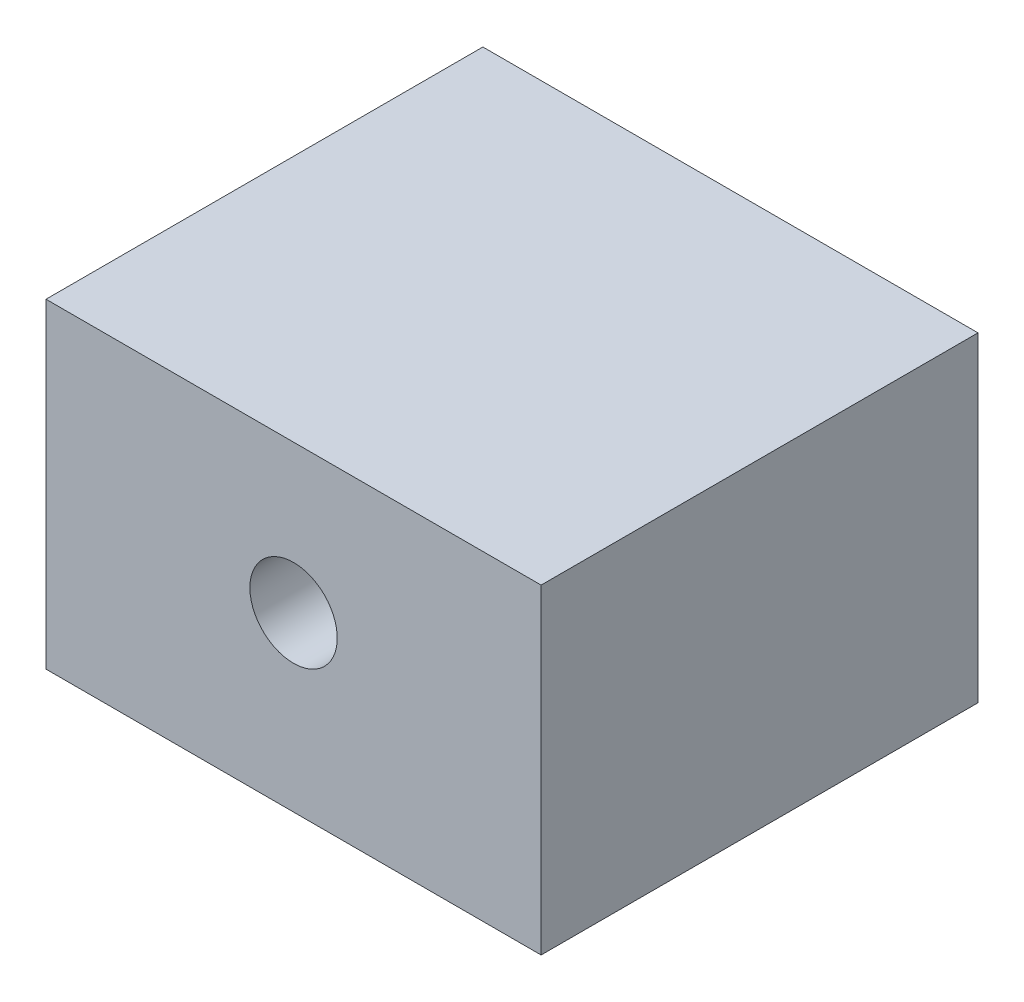
ISO-10303-21;
HEADER;
FILE_DESCRIPTION(('STEP AP214'),'2;1');
FILE_NAME('part.step','',(''),(''),'','','');
FILE_SCHEMA(('AUTOMOTIVE_DESIGN { 1 0 10303 214 1 1 1 1 }'));
ENDSEC;
DATA;
#1=APPLICATION_CONTEXT('core data for automotive mechanical design processes');
#2=APPLICATION_PROTOCOL_DEFINITION('international standard','automotive_design',2000,#1);
#3=PRODUCT_CONTEXT('',#1,'mechanical');
#4=PRODUCT('Part','Part','',(#3));
#5=PRODUCT_RELATED_PRODUCT_CATEGORY('part','',(#4));
#6=PRODUCT_DEFINITION_FORMATION('','',#4);
#7=PRODUCT_DEFINITION_CONTEXT('part definition',#1,'design');
#8=PRODUCT_DEFINITION('design','',#6,#7);
#9=PRODUCT_DEFINITION_SHAPE('','',#8);
#10=(LENGTH_UNIT() NAMED_UNIT(*) SI_UNIT(.MILLI.,.METRE.));
#11=(NAMED_UNIT(*) PLANE_ANGLE_UNIT() SI_UNIT($,.RADIAN.));
#12=(NAMED_UNIT(*) SI_UNIT($,.STERADIAN.) SOLID_ANGLE_UNIT());
#13=UNCERTAINTY_MEASURE_WITH_UNIT(LENGTH_MEASURE(1.E-05),#10,'distance_accuracy_value','');
#14=(GEOMETRIC_REPRESENTATION_CONTEXT(3) GLOBAL_UNCERTAINTY_ASSIGNED_CONTEXT((#13)) GLOBAL_UNIT_ASSIGNED_CONTEXT((#10,
#11,#12)) REPRESENTATION_CONTEXT('',''));
#15=CARTESIAN_POINT('',(0.,0.,0.));
#16=DIRECTION('',(0.,0.,1.));
#17=DIRECTION('',(1.,0.,0.));
#18=AXIS2_PLACEMENT_3D('',#15,#16,#17);
#19=CARTESIAN_POINT('',(17.,22.,-15.));
#20=DIRECTION('',(-1.,0.,0.));
#21=DIRECTION('',(0.,0.,1.));
#22=AXIS2_PLACEMENT_3D('',#19,#20,#21);
#23=PLANE('',#22);
#24=DIRECTION('',(0.,0.,-1.));
#25=VECTOR('',#24,1.);
#26=CARTESIAN_POINT('',(17.,0.,-15.));
#27=LINE('',#26,#25);
#28=CARTESIAN_POINT('',(17.,0.,15.));
#29=VERTEX_POINT('',#28);
#30=CARTESIAN_POINT('',(17.,0.,-15.));
#31=VERTEX_POINT('',#30);
#32=EDGE_CURVE('E104',#29,#31,#27,.T.);
#33=ORIENTED_EDGE('',*,*,#32,.T.);
#34=DIRECTION('',(0.,-1.,0.));
#35=VECTOR('',#34,1.);
#36=CARTESIAN_POINT('',(17.,22.,-15.));
#37=LINE('',#36,#35);
#38=CARTESIAN_POINT('',(17.,22.,-15.));
#39=VERTEX_POINT('',#38);
#40=EDGE_CURVE('E11',#39,#31,#37,.T.);
#41=ORIENTED_EDGE('',*,*,#40,.F.);
#42=DIRECTION('',(0.,0.,-1.));
#43=VECTOR('',#42,1.);
#44=CARTESIAN_POINT('',(17.,22.,-15.));
#45=LINE('',#44,#43);
#46=CARTESIAN_POINT('',(17.,22.,15.));
#47=VERTEX_POINT('',#46);
#48=EDGE_CURVE('E92',#47,#39,#45,.T.);
#49=ORIENTED_EDGE('',*,*,#48,.F.);
#50=DIRECTION('',(0.,-1.,0.));
#51=VECTOR('',#50,1.);
#52=CARTESIAN_POINT('',(17.,22.,15.));
#53=LINE('',#52,#51);
#54=EDGE_CURVE('E100',#47,#29,#53,.T.);
#55=ORIENTED_EDGE('',*,*,#54,.T.);
#56=EDGE_LOOP('',(#33,#41,#49,#55));
#57=FACE_BOUND('',#56,.T.);
#58=ADVANCED_FACE('F41',(#57),#23,.F.);
#59=CARTESIAN_POINT('',(-17.,22.,-15.));
#60=DIRECTION('',(0.,0.,1.));
#61=DIRECTION('',(1.,0.,0.));
#62=AXIS2_PLACEMENT_3D('',#59,#60,#61);
#63=PLANE('',#62);
#64=CARTESIAN_POINT('',(0.,11.8462916582385,-15.));
#65=DIRECTION('',(0.,0.,-1.));
#66=DIRECTION('',(-1.,0.,0.));
#67=AXIS2_PLACEMENT_3D('',#64,#65,#66);
#68=CIRCLE('',#67,3.);
#69=CARTESIAN_POINT('',(-3.,11.8462916582385,-15.));
#70=VERTEX_POINT('',#69);
#71=EDGE_CURVE('E107',#70,#70,#68,.T.);
#72=ORIENTED_EDGE('',*,*,#71,.F.);
#73=EDGE_LOOP('',(#72));
#74=FACE_BOUND('',#73,.T.);
#75=DIRECTION('',(-1.,0.,0.));
#76=VECTOR('',#75,1.);
#77=CARTESIAN_POINT('',(-17.,0.,-15.));
#78=LINE('',#77,#76);
#79=CARTESIAN_POINT('',(-17.,0.,-15.));
#80=VERTEX_POINT('',#79);
#81=EDGE_CURVE('E96',#31,#80,#78,.T.);
#82=ORIENTED_EDGE('',*,*,#81,.T.);
#83=DIRECTION('',(0.,-1.,0.));
#84=VECTOR('',#83,1.);
#85=CARTESIAN_POINT('',(-17.,22.,-15.));
#86=LINE('',#85,#84);
#87=CARTESIAN_POINT('',(-17.,22.,-15.));
#88=VERTEX_POINT('',#87);
#89=EDGE_CURVE('E49',#88,#80,#86,.T.);
#90=ORIENTED_EDGE('',*,*,#89,.F.);
#91=DIRECTION('',(-1.,0.,0.));
#92=VECTOR('',#91,1.);
#93=CARTESIAN_POINT('',(-17.,22.,-15.));
#94=LINE('',#93,#92);
#95=EDGE_CURVE('E87',#39,#88,#94,.T.);
#96=ORIENTED_EDGE('',*,*,#95,.F.);
#97=ORIENTED_EDGE('',*,*,#40,.T.);
#98=EDGE_LOOP('',(#82,#90,#96,#97));
#99=FACE_BOUND('',#98,.T.);
#100=ADVANCED_FACE('F95',(#74,#99),#63,.F.);
#101=CARTESIAN_POINT('',(-17.,22.,-15.));
#102=DIRECTION('',(1.,0.,0.));
#103=DIRECTION('',(0.,0.,-1.));
#104=AXIS2_PLACEMENT_3D('',#101,#102,#103);
#105=PLANE('',#104);
#106=DIRECTION('',(0.,0.,1.));
#107=VECTOR('',#106,1.);
#108=CARTESIAN_POINT('',(-17.,0.,-15.));
#109=LINE('',#108,#107);
#110=CARTESIAN_POINT('',(-17.,0.,15.));
#111=VERTEX_POINT('',#110);
#112=EDGE_CURVE('E74',#80,#111,#109,.T.);
#113=ORIENTED_EDGE('',*,*,#112,.T.);
#114=DIRECTION('',(0.,-1.,0.));
#115=VECTOR('',#114,1.);
#116=CARTESIAN_POINT('',(-17.,22.,15.));
#117=LINE('',#116,#115);
#118=CARTESIAN_POINT('',(-17.,22.,15.));
#119=VERTEX_POINT('',#118);
#120=EDGE_CURVE('E97',#119,#111,#117,.T.);
#121=ORIENTED_EDGE('',*,*,#120,.F.);
#122=DIRECTION('',(0.,0.,1.));
#123=VECTOR('',#122,1.);
#124=CARTESIAN_POINT('',(-17.,22.,-15.));
#125=LINE('',#124,#123);
#126=EDGE_CURVE('E90',#88,#119,#125,.T.);
#127=ORIENTED_EDGE('',*,*,#126,.F.);
#128=ORIENTED_EDGE('',*,*,#89,.T.);
#129=EDGE_LOOP('',(#113,#121,#127,#128));
#130=FACE_BOUND('',#129,.T.);
#131=ADVANCED_FACE('F98',(#130),#105,.F.);
#132=CARTESIAN_POINT('',(-17.,22.,15.));
#133=DIRECTION('',(0.,0.,-1.));
#134=DIRECTION('',(-1.,0.,0.));
#135=AXIS2_PLACEMENT_3D('',#132,#133,#134);
#136=PLANE('',#135);
#137=CARTESIAN_POINT('',(0.,11.8462916582385,15.));
#138=DIRECTION('',(0.,0.,-1.));
#139=DIRECTION('',(-1.,0.,0.));
#140=AXIS2_PLACEMENT_3D('',#137,#138,#139);
#141=CIRCLE('',#140,3.);
#142=CARTESIAN_POINT('',(-3.,11.8462916582385,15.));
#143=VERTEX_POINT('',#142);
#144=EDGE_CURVE('E118',#143,#143,#141,.T.);
#145=ORIENTED_EDGE('',*,*,#144,.T.);
#146=EDGE_LOOP('',(#145));
#147=FACE_BOUND('',#146,.T.);
#148=DIRECTION('',(1.,0.,0.));
#149=VECTOR('',#148,1.);
#150=CARTESIAN_POINT('',(-17.,0.,15.));
#151=LINE('',#150,#149);
#152=EDGE_CURVE('E80',#111,#29,#151,.T.);
#153=ORIENTED_EDGE('',*,*,#152,.T.);
#154=ORIENTED_EDGE('',*,*,#54,.F.);
#155=DIRECTION('',(1.,0.,0.));
#156=VECTOR('',#155,1.);
#157=CARTESIAN_POINT('',(-17.,22.,15.));
#158=LINE('',#157,#156);
#159=EDGE_CURVE('E57',#119,#47,#158,.T.);
#160=ORIENTED_EDGE('',*,*,#159,.F.);
#161=ORIENTED_EDGE('',*,*,#120,.T.);
#162=EDGE_LOOP('',(#153,#154,#160,#161));
#163=FACE_BOUND('',#162,.T.);
#164=ADVANCED_FACE('F112',(#147,#163),#136,.F.);
#165=CARTESIAN_POINT('',(0.,22.,0.));
#166=DIRECTION('',(0.,1.,0.));
#167=DIRECTION('',(0.,0.,1.));
#168=AXIS2_PLACEMENT_3D('',#165,#166,#167);
#169=PLANE('',#168);
#170=ORIENTED_EDGE('',*,*,#48,.T.);
#171=ORIENTED_EDGE('',*,*,#95,.T.);
#172=ORIENTED_EDGE('',*,*,#126,.T.);
#173=ORIENTED_EDGE('',*,*,#159,.T.);
#174=EDGE_LOOP('',(#170,#171,#172,#173));
#175=FACE_BOUND('',#174,.T.);
#176=ADVANCED_FACE('F88',(#175),#169,.T.);
#177=CARTESIAN_POINT('',(0.,0.,0.));
#178=DIRECTION('',(0.,1.,0.));
#179=DIRECTION('',(0.,0.,1.));
#180=AXIS2_PLACEMENT_3D('',#177,#178,#179);
#181=PLANE('',#180);
#182=CARTESIAN_POINT('',(12.,0.,-9.));
#183=DIRECTION('',(0.,-1.,0.));
#184=DIRECTION('',(0.,0.,-1.));
#185=AXIS2_PLACEMENT_3D('',#182,#183,#184);
#186=CIRCLE('',#185,2.1);
#187=CARTESIAN_POINT('',(12.,0.,-11.1));
#188=VERTEX_POINT('',#187);
#189=EDGE_CURVE('E127',#188,#188,#186,.T.);
#190=ORIENTED_EDGE('',*,*,#189,.F.);
#191=EDGE_LOOP('',(#190));
#192=FACE_BOUND('',#191,.T.);
#193=CARTESIAN_POINT('',(-12.,0.,9.00000000000001));
#194=DIRECTION('',(0.,-1.,0.));
#195=DIRECTION('',(0.,0.,-1.));
#196=AXIS2_PLACEMENT_3D('',#193,#194,#195);
#197=CIRCLE('',#196,2.1);
#198=CARTESIAN_POINT('',(-12.,0.,6.9));
#199=VERTEX_POINT('',#198);
#200=EDGE_CURVE('E133',#199,#199,#197,.T.);
#201=ORIENTED_EDGE('',*,*,#200,.F.);
#202=EDGE_LOOP('',(#201));
#203=FACE_BOUND('',#202,.T.);
#204=CARTESIAN_POINT('',(-12.,0.,-9.));
#205=DIRECTION('',(0.,-1.,0.));
#206=DIRECTION('',(0.,0.,-1.));
#207=AXIS2_PLACEMENT_3D('',#204,#205,#206);
#208=CIRCLE('',#207,2.1);
#209=CARTESIAN_POINT('',(-12.,0.,-11.1));
#210=VERTEX_POINT('',#209);
#211=EDGE_CURVE('E134',#210,#210,#208,.T.);
#212=ORIENTED_EDGE('',*,*,#211,.F.);
#213=EDGE_LOOP('',(#212));
#214=FACE_BOUND('',#213,.T.);
#215=CARTESIAN_POINT('',(12.,0.,9.));
#216=DIRECTION('',(0.,-1.,0.));
#217=DIRECTION('',(0.,0.,-1.));
#218=AXIS2_PLACEMENT_3D('',#215,#216,#217);
#219=CIRCLE('',#218,2.1);
#220=CARTESIAN_POINT('',(12.,0.,6.9));
#221=VERTEX_POINT('',#220);
#222=EDGE_CURVE('E124',#221,#221,#219,.T.);
#223=ORIENTED_EDGE('',*,*,#222,.F.);
#224=EDGE_LOOP('',(#223));
#225=FACE_BOUND('',#224,.T.);
#226=ORIENTED_EDGE('',*,*,#32,.F.);
#227=ORIENTED_EDGE('',*,*,#152,.F.);
#228=ORIENTED_EDGE('',*,*,#112,.F.);
#229=ORIENTED_EDGE('',*,*,#81,.F.);
#230=EDGE_LOOP('',(#226,#227,#228,#229));
#231=FACE_BOUND('',#230,.T.);
#232=ADVANCED_FACE('F115',(#192,#203,#214,#225,#231),#181,.F.);
#233=CARTESIAN_POINT('',(0.,11.8462916582385,-15.));
#234=DIRECTION('',(0.,0.,1.));
#235=DIRECTION('',(1.,0.,0.));
#236=AXIS2_PLACEMENT_3D('',#233,#234,#235);
#237=CYLINDRICAL_SURFACE('',#236,3.);
#238=ORIENTED_EDGE('',*,*,#71,.T.);
#239=EDGE_LOOP('',(#238));
#240=FACE_BOUND('',#239,.T.);
#241=ORIENTED_EDGE('',*,*,#144,.F.);
#242=EDGE_LOOP('',(#241));
#243=FACE_BOUND('',#242,.T.);
#244=ADVANCED_FACE('F152',(#240,#243),#237,.F.);
#245=CARTESIAN_POINT('',(12.,10.,9.));
#246=DIRECTION('',(0.,-1.,0.));
#247=DIRECTION('',(0.,0.,-1.));
#248=AXIS2_PLACEMENT_3D('',#245,#246,#247);
#249=CYLINDRICAL_SURFACE('',#248,2.1);
#250=CARTESIAN_POINT('',(12.,10.,9.));
#251=DIRECTION('',(0.,-1.,0.));
#252=DIRECTION('',(0.,0.,-1.));
#253=AXIS2_PLACEMENT_3D('',#250,#251,#252);
#254=CIRCLE('',#253,2.1);
#255=CARTESIAN_POINT('',(12.,10.,6.9));
#256=VERTEX_POINT('',#255);
#257=EDGE_CURVE('E121',#256,#256,#254,.T.);
#258=ORIENTED_EDGE('',*,*,#257,.F.);
#259=EDGE_LOOP('',(#258));
#260=FACE_BOUND('',#259,.T.);
#261=ORIENTED_EDGE('',*,*,#222,.T.);
#262=EDGE_LOOP('',(#261));
#263=FACE_BOUND('',#262,.T.);
#264=ADVANCED_FACE('F157',(#260,#263),#249,.F.);
#265=CARTESIAN_POINT('',(12.,10.,9.));
#266=DIRECTION('',(0.,-1.,0.));
#267=DIRECTION('',(0.,0.,-1.));
#268=AXIS2_PLACEMENT_3D('',#265,#266,#267);
#269=PLANE('',#268);
#270=ORIENTED_EDGE('',*,*,#257,.T.);
#271=EDGE_LOOP('',(#270));
#272=FACE_BOUND('',#271,.T.);
#273=ADVANCED_FACE('F159',(#272),#269,.T.);
#274=CARTESIAN_POINT('',(-12.,10.,-9.));
#275=DIRECTION('',(0.,-1.,0.));
#276=DIRECTION('',(0.,0.,-1.));
#277=AXIS2_PLACEMENT_3D('',#274,#275,#276);
#278=CYLINDRICAL_SURFACE('',#277,2.1);
#279=CARTESIAN_POINT('',(-12.,10.,-9.));
#280=DIRECTION('',(0.,-1.,0.));
#281=DIRECTION('',(0.,0.,-1.));
#282=AXIS2_PLACEMENT_3D('',#279,#280,#281);
#283=CIRCLE('',#282,2.1);
#284=CARTESIAN_POINT('',(-12.,10.,-11.1));
#285=VERTEX_POINT('',#284);
#286=EDGE_CURVE('E142',#285,#285,#283,.T.);
#287=ORIENTED_EDGE('',*,*,#286,.F.);
#288=EDGE_LOOP('',(#287));
#289=FACE_BOUND('',#288,.T.);
#290=ORIENTED_EDGE('',*,*,#211,.T.);
#291=EDGE_LOOP('',(#290));
#292=FACE_BOUND('',#291,.T.);
#293=ADVANCED_FACE('F148',(#289,#292),#278,.F.);
#294=CARTESIAN_POINT('',(-12.,10.,-9.));
#295=DIRECTION('',(0.,-1.,0.));
#296=DIRECTION('',(0.,0.,-1.));
#297=AXIS2_PLACEMENT_3D('',#294,#295,#296);
#298=PLANE('',#297);
#299=ORIENTED_EDGE('',*,*,#286,.T.);
#300=EDGE_LOOP('',(#299));
#301=FACE_BOUND('',#300,.T.);
#302=ADVANCED_FACE('F233',(#301),#298,.T.);
#303=CARTESIAN_POINT('',(-12.,10.,9.00000000000001));
#304=DIRECTION('',(0.,-1.,0.));
#305=DIRECTION('',(0.,0.,-1.));
#306=AXIS2_PLACEMENT_3D('',#303,#304,#305);
#307=CYLINDRICAL_SURFACE('',#306,2.1);
#308=CARTESIAN_POINT('',(-12.,10.,9.00000000000001));
#309=DIRECTION('',(0.,-1.,0.));
#310=DIRECTION('',(0.,0.,-1.));
#311=AXIS2_PLACEMENT_3D('',#308,#309,#310);
#312=CIRCLE('',#311,2.1);
#313=CARTESIAN_POINT('',(-12.,10.,6.9));
#314=VERTEX_POINT('',#313);
#315=EDGE_CURVE('E130',#314,#314,#312,.T.);
#316=ORIENTED_EDGE('',*,*,#315,.F.);
#317=EDGE_LOOP('',(#316));
#318=FACE_BOUND('',#317,.T.);
#319=ORIENTED_EDGE('',*,*,#200,.T.);
#320=EDGE_LOOP('',(#319));
#321=FACE_BOUND('',#320,.T.);
#322=ADVANCED_FACE('F242',(#318,#321),#307,.F.);
#323=CARTESIAN_POINT('',(-12.,10.,9.00000000000001));
#324=DIRECTION('',(0.,-1.,0.));
#325=DIRECTION('',(0.,0.,-1.));
#326=AXIS2_PLACEMENT_3D('',#323,#324,#325);
#327=PLANE('',#326);
#328=ORIENTED_EDGE('',*,*,#315,.T.);
#329=EDGE_LOOP('',(#328));
#330=FACE_BOUND('',#329,.T.);
#331=ADVANCED_FACE('F251',(#330),#327,.T.);
#332=CARTESIAN_POINT('',(12.,10.,-9.));
#333=DIRECTION('',(0.,-1.,0.));
#334=DIRECTION('',(0.,0.,-1.));
#335=AXIS2_PLACEMENT_3D('',#332,#333,#334);
#336=CYLINDRICAL_SURFACE('',#335,2.1);
#337=CARTESIAN_POINT('',(12.,10.,-9.));
#338=DIRECTION('',(0.,-1.,0.));
#339=DIRECTION('',(0.,0.,-1.));
#340=AXIS2_PLACEMENT_3D('',#337,#338,#339);
#341=CIRCLE('',#340,2.1);
#342=CARTESIAN_POINT('',(12.,10.,-11.1));
#343=VERTEX_POINT('',#342);
#344=EDGE_CURVE('E137',#343,#343,#341,.T.);
#345=ORIENTED_EDGE('',*,*,#344,.F.);
#346=EDGE_LOOP('',(#345));
#347=FACE_BOUND('',#346,.T.);
#348=ORIENTED_EDGE('',*,*,#189,.T.);
#349=EDGE_LOOP('',(#348));
#350=FACE_BOUND('',#349,.T.);
#351=ADVANCED_FACE('F260',(#347,#350),#336,.F.);
#352=CARTESIAN_POINT('',(12.,10.,-9.));
#353=DIRECTION('',(0.,-1.,0.));
#354=DIRECTION('',(0.,0.,-1.));
#355=AXIS2_PLACEMENT_3D('',#352,#353,#354);
#356=PLANE('',#355);
#357=ORIENTED_EDGE('',*,*,#344,.T.);
#358=EDGE_LOOP('',(#357));
#359=FACE_BOUND('',#358,.T.);
#360=ADVANCED_FACE('F269',(#359),#356,.T.);
#361=CLOSED_SHELL('',(#58,#100,#131,#164,#176,#232,#244,#264,#273,#293,#302,#322,#331,#351,#360));
#362=MANIFOLD_SOLID_BREP('B2',#361);
#363=ADVANCED_BREP_SHAPE_REPRESENTATION('',(#18,#362),#14);
#364=SHAPE_DEFINITION_REPRESENTATION(#9,#363);
ENDSEC;
END-ISO-10303-21;
